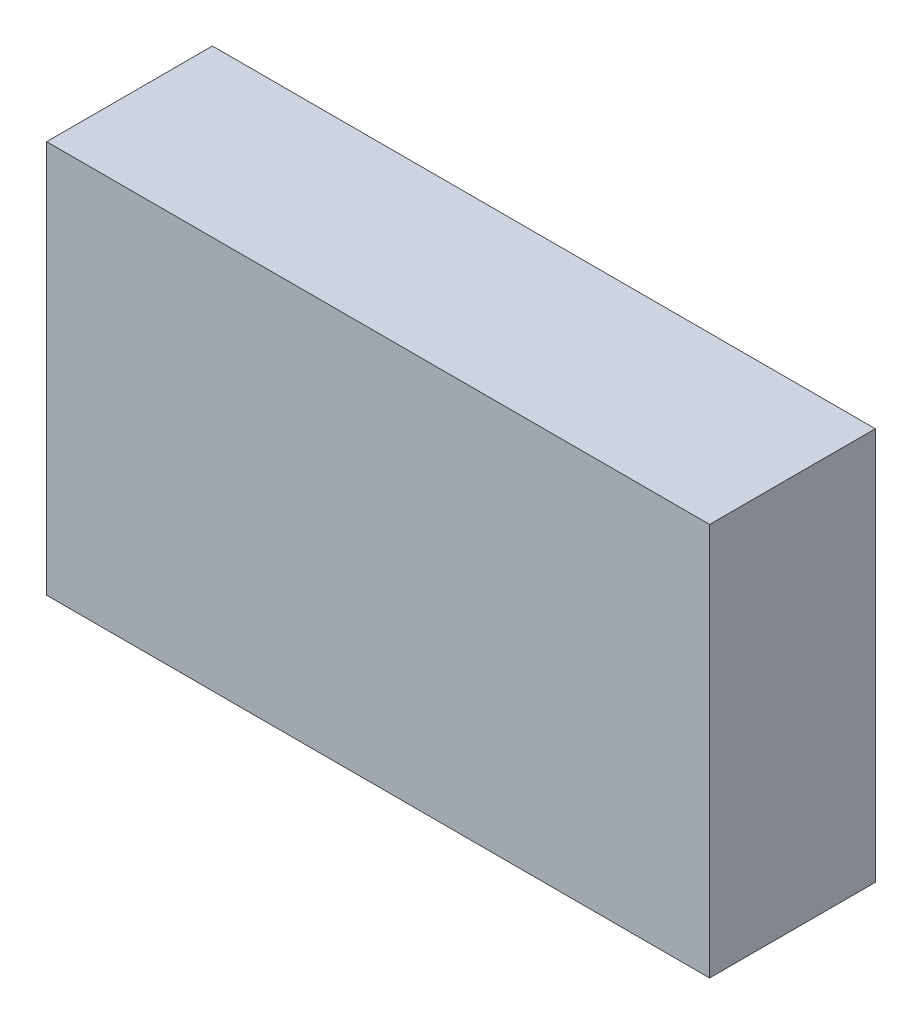
ISO-10303-21;
HEADER;
FILE_DESCRIPTION(('STEP AP214'),'2;1');
FILE_NAME('part.step','',(''),(''),'','','');
FILE_SCHEMA(('AUTOMOTIVE_DESIGN { 1 0 10303 214 1 1 1 1 }'));
ENDSEC;
DATA;
#1=APPLICATION_CONTEXT('core data for automotive mechanical design processes');
#2=APPLICATION_PROTOCOL_DEFINITION('international standard','automotive_design',2000,#1);
#3=PRODUCT_CONTEXT('',#1,'mechanical');
#4=PRODUCT('Part','Part','',(#3));
#5=PRODUCT_RELATED_PRODUCT_CATEGORY('part','',(#4));
#6=PRODUCT_DEFINITION_FORMATION('','',#4);
#7=PRODUCT_DEFINITION_CONTEXT('part definition',#1,'design');
#8=PRODUCT_DEFINITION('design','',#6,#7);
#9=PRODUCT_DEFINITION_SHAPE('','',#8);
#10=(LENGTH_UNIT() NAMED_UNIT(*) SI_UNIT(.MILLI.,.METRE.));
#11=(NAMED_UNIT(*) PLANE_ANGLE_UNIT() SI_UNIT($,.RADIAN.));
#12=(NAMED_UNIT(*) SI_UNIT($,.STERADIAN.) SOLID_ANGLE_UNIT());
#13=UNCERTAINTY_MEASURE_WITH_UNIT(LENGTH_MEASURE(1.E-05),#10,'distance_accuracy_value','');
#14=(GEOMETRIC_REPRESENTATION_CONTEXT(3) GLOBAL_UNCERTAINTY_ASSIGNED_CONTEXT((#13)) GLOBAL_UNIT_ASSIGNED_CONTEXT((#10,
#11,#12)) REPRESENTATION_CONTEXT('',''));
#15=CARTESIAN_POINT('',(0.,0.,0.));
#16=DIRECTION('',(0.,0.,1.));
#17=DIRECTION('',(1.,0.,0.));
#18=AXIS2_PLACEMENT_3D('',#15,#16,#17);
#19=CARTESIAN_POINT('',(0.,0.,10.));
#20=DIRECTION('',(1.,0.,0.));
#21=DIRECTION('',(0.,0.,-1.));
#22=AXIS2_PLACEMENT_3D('',#19,#20,#21);
#23=PLANE('',#22);
#24=DIRECTION('',(0.,-1.,0.));
#25=VECTOR('',#24,1.);
#26=CARTESIAN_POINT('',(0.,0.,0.));
#27=LINE('',#26,#25);
#28=CARTESIAN_POINT('',(0.,23.7,0.));
#29=VERTEX_POINT('',#28);
#30=CARTESIAN_POINT('',(0.,0.,0.));
#31=VERTEX_POINT('',#30);
#32=EDGE_CURVE('E106',#29,#31,#27,.T.);
#33=ORIENTED_EDGE('',*,*,#32,.T.);
#34=DIRECTION('',(0.,0.,-1.));
#35=VECTOR('',#34,1.);
#36=CARTESIAN_POINT('',(0.,0.,10.));
#37=LINE('',#36,#35);
#38=CARTESIAN_POINT('',(0.,0.,10.));
#39=VERTEX_POINT('',#38);
#40=EDGE_CURVE('E11',#39,#31,#37,.T.);
#41=ORIENTED_EDGE('',*,*,#40,.F.);
#42=DIRECTION('',(0.,-1.,0.));
#43=VECTOR('',#42,1.);
#44=CARTESIAN_POINT('',(0.,0.,10.));
#45=LINE('',#44,#43);
#46=CARTESIAN_POINT('',(0.,23.7,10.));
#47=VERTEX_POINT('',#46);
#48=EDGE_CURVE('E92',#47,#39,#45,.T.);
#49=ORIENTED_EDGE('',*,*,#48,.F.);
#50=DIRECTION('',(0.,0.,-1.));
#51=VECTOR('',#50,1.);
#52=CARTESIAN_POINT('',(0.,23.7,10.));
#53=LINE('',#52,#51);
#54=EDGE_CURVE('E105',#47,#29,#53,.T.);
#55=ORIENTED_EDGE('',*,*,#54,.T.);
#56=EDGE_LOOP('',(#33,#41,#49,#55));
#57=FACE_BOUND('',#56,.T.);
#58=ADVANCED_FACE('F43',(#57),#23,.F.);
#59=CARTESIAN_POINT('',(0.,0.,10.));
#60=DIRECTION('',(0.,1.,0.));
#61=DIRECTION('',(0.,0.,1.));
#62=AXIS2_PLACEMENT_3D('',#59,#60,#61);
#63=PLANE('',#62);
#64=DIRECTION('',(1.,0.,0.));
#65=VECTOR('',#64,1.);
#66=CARTESIAN_POINT('',(0.,0.,0.));
#67=LINE('',#66,#65);
#68=CARTESIAN_POINT('',(40.,0.,0.));
#69=VERTEX_POINT('',#68);
#70=EDGE_CURVE('E97',#31,#69,#67,.T.);
#71=ORIENTED_EDGE('',*,*,#70,.T.);
#72=DIRECTION('',(0.,0.,-1.));
#73=VECTOR('',#72,1.);
#74=CARTESIAN_POINT('',(40.,0.,10.));
#75=LINE('',#74,#73);
#76=CARTESIAN_POINT('',(40.,0.,10.));
#77=VERTEX_POINT('',#76);
#78=EDGE_CURVE('E51',#77,#69,#75,.T.);
#79=ORIENTED_EDGE('',*,*,#78,.F.);
#80=DIRECTION('',(1.,0.,0.));
#81=VECTOR('',#80,1.);
#82=CARTESIAN_POINT('',(0.,0.,10.));
#83=LINE('',#82,#81);
#84=EDGE_CURVE('E87',#39,#77,#83,.T.);
#85=ORIENTED_EDGE('',*,*,#84,.F.);
#86=ORIENTED_EDGE('',*,*,#40,.T.);
#87=EDGE_LOOP('',(#71,#79,#85,#86));
#88=FACE_BOUND('',#87,.T.);
#89=ADVANCED_FACE('F100',(#88),#63,.F.);
#90=CARTESIAN_POINT('',(40.,0.,10.));
#91=DIRECTION('',(-1.,0.,0.));
#92=DIRECTION('',(0.,0.,1.));
#93=AXIS2_PLACEMENT_3D('',#90,#91,#92);
#94=PLANE('',#93);
#95=DIRECTION('',(0.,1.,0.));
#96=VECTOR('',#95,1.);
#97=CARTESIAN_POINT('',(40.,0.,0.));
#98=LINE('',#97,#96);
#99=CARTESIAN_POINT('',(40.,23.7,0.));
#100=VERTEX_POINT('',#99);
#101=EDGE_CURVE('E78',#69,#100,#98,.T.);
#102=ORIENTED_EDGE('',*,*,#101,.T.);
#103=DIRECTION('',(0.,0.,-1.));
#104=VECTOR('',#103,1.);
#105=CARTESIAN_POINT('',(40.,23.7,10.));
#106=LINE('',#105,#104);
#107=CARTESIAN_POINT('',(40.,23.7,10.));
#108=VERTEX_POINT('',#107);
#109=EDGE_CURVE('E98',#108,#100,#106,.T.);
#110=ORIENTED_EDGE('',*,*,#109,.F.);
#111=DIRECTION('',(0.,1.,0.));
#112=VECTOR('',#111,1.);
#113=CARTESIAN_POINT('',(40.,0.,10.));
#114=LINE('',#113,#112);
#115=EDGE_CURVE('E95',#77,#108,#114,.T.);
#116=ORIENTED_EDGE('',*,*,#115,.F.);
#117=ORIENTED_EDGE('',*,*,#78,.T.);
#118=EDGE_LOOP('',(#102,#110,#116,#117));
#119=FACE_BOUND('',#118,.T.);
#120=ADVANCED_FACE('F99',(#119),#94,.F.);
#121=CARTESIAN_POINT('',(0.,23.7,10.));
#122=DIRECTION('',(0.,-1.,0.));
#123=DIRECTION('',(0.,0.,-1.));
#124=AXIS2_PLACEMENT_3D('',#121,#122,#123);
#125=PLANE('',#124);
#126=DIRECTION('',(-1.,0.,0.));
#127=VECTOR('',#126,1.);
#128=CARTESIAN_POINT('',(0.,23.7,0.));
#129=LINE('',#128,#127);
#130=EDGE_CURVE('E85',#100,#29,#129,.T.);
#131=ORIENTED_EDGE('',*,*,#130,.T.);
#132=ORIENTED_EDGE('',*,*,#54,.F.);
#133=DIRECTION('',(-1.,0.,0.));
#134=VECTOR('',#133,1.);
#135=CARTESIAN_POINT('',(0.,23.7,10.));
#136=LINE('',#135,#134);
#137=EDGE_CURVE('E56',#108,#47,#136,.T.);
#138=ORIENTED_EDGE('',*,*,#137,.F.);
#139=ORIENTED_EDGE('',*,*,#109,.T.);
#140=EDGE_LOOP('',(#131,#132,#138,#139));
#141=FACE_BOUND('',#140,.T.);
#142=ADVANCED_FACE('F111',(#141),#125,.F.);
#143=CARTESIAN_POINT('',(0.,0.,10.));
#144=DIRECTION('',(0.,0.,-1.));
#145=DIRECTION('',(-1.,0.,0.));
#146=AXIS2_PLACEMENT_3D('',#143,#144,#145);
#147=PLANE('',#146);
#148=ORIENTED_EDGE('',*,*,#48,.T.);
#149=ORIENTED_EDGE('',*,*,#84,.T.);
#150=ORIENTED_EDGE('',*,*,#115,.T.);
#151=ORIENTED_EDGE('',*,*,#137,.T.);
#152=EDGE_LOOP('',(#148,#149,#150,#151));
#153=FACE_BOUND('',#152,.T.);
#154=ADVANCED_FACE('F89',(#153),#147,.F.);
#155=CARTESIAN_POINT('',(0.,0.,0.));
#156=DIRECTION('',(0.,0.,-1.));
#157=DIRECTION('',(-1.,0.,0.));
#158=AXIS2_PLACEMENT_3D('',#155,#156,#157);
#159=PLANE('',#158);
#160=ORIENTED_EDGE('',*,*,#32,.F.);
#161=ORIENTED_EDGE('',*,*,#130,.F.);
#162=ORIENTED_EDGE('',*,*,#101,.F.);
#163=ORIENTED_EDGE('',*,*,#70,.F.);
#164=EDGE_LOOP('',(#160,#161,#162,#163));
#165=FACE_BOUND('',#164,.T.);
#166=ADVANCED_FACE('F116',(#165),#159,.T.);
#167=CLOSED_SHELL('',(#58,#89,#120,#142,#154,#166));
#168=MANIFOLD_SOLID_BREP('B2',#167);
#169=ADVANCED_BREP_SHAPE_REPRESENTATION('',(#18,#168),#14);
#170=SHAPE_DEFINITION_REPRESENTATION(#9,#169);
ENDSEC;
END-ISO-10303-21;
